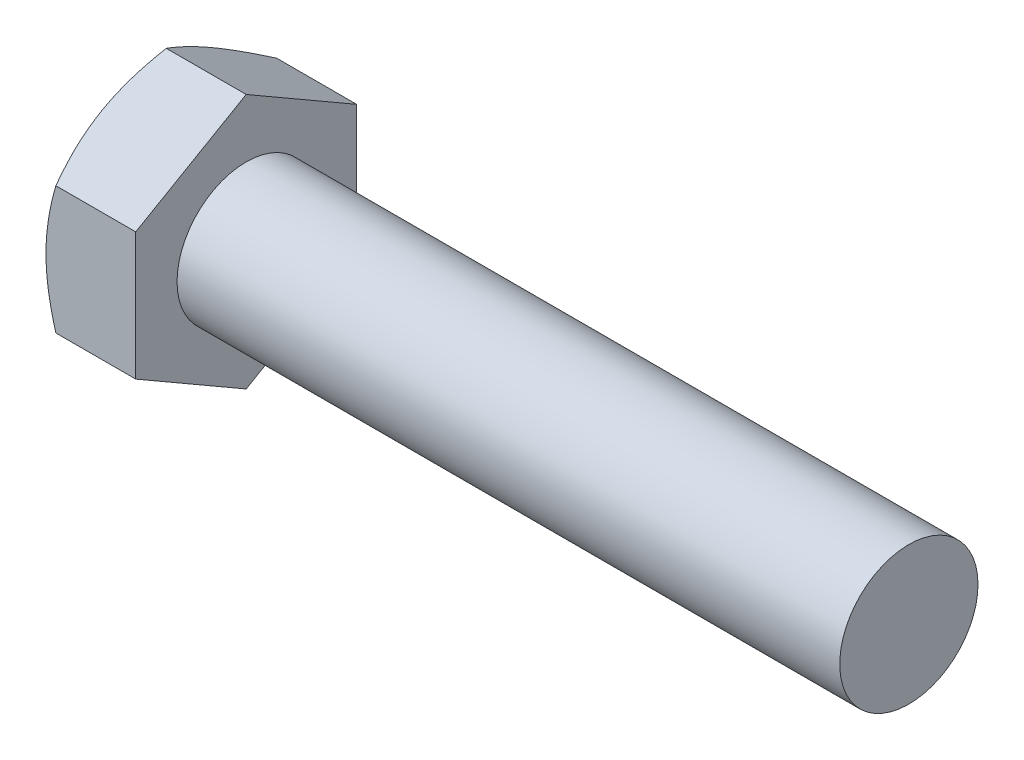
ISO-10303-21;
HEADER;
FILE_DESCRIPTION(('STEP AP214'),'2;1');
FILE_NAME('part.step','',(''),(''),'','','');
FILE_SCHEMA(('AUTOMOTIVE_DESIGN { 1 0 10303 214 1 1 1 1 }'));
ENDSEC;
DATA;
#1=APPLICATION_CONTEXT('core data for automotive mechanical design processes');
#2=APPLICATION_PROTOCOL_DEFINITION('international standard','automotive_design',2000,#1);
#3=PRODUCT_CONTEXT('',#1,'mechanical');
#4=PRODUCT('Part','Part','',(#3));
#5=PRODUCT_RELATED_PRODUCT_CATEGORY('part','',(#4));
#6=PRODUCT_DEFINITION_FORMATION('','',#4);
#7=PRODUCT_DEFINITION_CONTEXT('part definition',#1,'design');
#8=PRODUCT_DEFINITION('design','',#6,#7);
#9=PRODUCT_DEFINITION_SHAPE('','',#8);
#10=(LENGTH_UNIT() NAMED_UNIT(*) SI_UNIT(.MILLI.,.METRE.));
#11=(NAMED_UNIT(*) PLANE_ANGLE_UNIT() SI_UNIT($,.RADIAN.));
#12=(NAMED_UNIT(*) SI_UNIT($,.STERADIAN.) SOLID_ANGLE_UNIT());
#13=UNCERTAINTY_MEASURE_WITH_UNIT(LENGTH_MEASURE(1.E-05),#10,'distance_accuracy_value','');
#14=(GEOMETRIC_REPRESENTATION_CONTEXT(3) GLOBAL_UNCERTAINTY_ASSIGNED_CONTEXT((#13)) GLOBAL_UNIT_ASSIGNED_CONTEXT((#10,
#11,#12)) REPRESENTATION_CONTEXT('',''));
#15=CARTESIAN_POINT('',(0.,0.,0.));
#16=DIRECTION('',(0.,0.,1.));
#17=DIRECTION('',(1.,0.,0.));
#18=AXIS2_PLACEMENT_3D('',#15,#16,#17);
#19=CARTESIAN_POINT('',(-21.6296875,-3.66617420935412,6.35));
#20=DIRECTION('',(0.,0.,-1.));
#21=DIRECTION('',(0.,1.,0.));
#22=AXIS2_PLACEMENT_3D('',#19,#20,#21);
#23=PLANE('',#22);
#24=CARTESIAN_POINT('',(-18.4541834769885,-10.0051578251258,6.35));
#25=CARTESIAN_POINT('',(-18.5900222234139,-9.72641871453256,6.35));
#26=CARTESIAN_POINT('',(-18.7246031142947,-9.44705632305443,6.35));
#27=CARTESIAN_POINT('',(-18.9905446423704,-8.88675404130045,6.35));
#28=CARTESIAN_POINT('',(-19.1219048009689,-8.60581392410908,6.35));
#29=CARTESIAN_POINT('',(-19.3813277378285,-8.0406522250816,6.35));
#30=CARTESIAN_POINT('',(-19.5093699902051,-7.75642118995143,6.35));
#31=CARTESIAN_POINT('',(-19.7604196639286,-7.18575243067032,6.35));
#32=CARTESIAN_POINT('',(-19.8834273132207,-6.89931480712349,6.35));
#33=CARTESIAN_POINT('',(-20.1271475764687,-6.31401786014467,6.35));
#34=CARTESIAN_POINT('',(-20.2476408636132,-6.0150667257098,6.35));
#35=CARTESIAN_POINT('',(-20.47988315396,-5.41372540128068,6.35));
#36=CARTESIAN_POINT('',(-20.5916311984423,-5.11133483838043,6.35));
#37=CARTESIAN_POINT('',(-20.8035649270712,-4.50315126065895,6.35));
#38=CARTESIAN_POINT('',(-20.9037727029784,-4.19736601814086,6.35));
#39=CARTESIAN_POINT('',(-21.0895141243889,-3.58140865935075,6.35));
#40=CARTESIAN_POINT('',(-21.1750522271364,-3.27123790669066,6.35));
#41=CARTESIAN_POINT('',(-21.3270038522021,-2.64806579192565,6.35));
#42=CARTESIAN_POINT('',(-21.3935245757886,-2.33509098307937,6.35));
#43=CARTESIAN_POINT('',(-21.5037700576967,-1.70504553693546,6.35));
#44=CARTESIAN_POINT('',(-21.5474973030166,-1.38797535035514,6.35));
#45=CARTESIAN_POINT('',(-21.5930975842862,-0.912675962009664,6.35));
#46=CARTESIAN_POINT('',(-21.6049514186587,-0.7553670385577,6.35));
#47=CARTESIAN_POINT('',(-21.6219951344209,-0.440381615119712,6.35));
#48=CARTESIAN_POINT('',(-21.6271851309861,-0.282705121533834,6.35));
#49=CARTESIAN_POINT('',(-21.6307695942273,0.0327256239929831,6.35));
#50=CARTESIAN_POINT('',(-21.6291640243312,0.190479876347832,6.35));
#51=CARTESIAN_POINT('',(-21.6192001734955,0.505777218224735,6.35));
#52=CARTESIAN_POINT('',(-21.6108415849363,0.663320297799779,6.35));
#53=CARTESIAN_POINT('',(-21.5831706727625,1.03721532467461,6.35));
#54=CARTESIAN_POINT('',(-21.5609173960211,1.25335459941585,6.35));
#55=CARTESIAN_POINT('',(-21.5048783149472,1.68412111995772,6.35));
#56=CARTESIAN_POINT('',(-21.471091076449,1.89874817433563,6.35));
#57=CARTESIAN_POINT('',(-21.3542124834382,2.54005767892036,6.35));
#58=CARTESIAN_POINT('',(-21.2556219738062,2.96395796144147,6.35));
#59=CARTESIAN_POINT('',(-21.0834504797159,3.59815173246438,6.35));
#60=CARTESIAN_POINT('',(-21.021156614797,3.8116994086178,6.35));
#61=CARTESIAN_POINT('',(-20.8898005131534,4.23672342972449,6.35));
#62=CARTESIAN_POINT('',(-20.8207382240341,4.44819975862949,6.35));
#63=CARTESIAN_POINT('',(-20.6769779868225,4.86914435236875,6.35));
#64=CARTESIAN_POINT('',(-20.6022816144661,5.07861316032889,6.35));
#65=CARTESIAN_POINT('',(-20.4481618438055,5.49579319916624,6.35));
#66=CARTESIAN_POINT('',(-20.3687385552769,5.70350447073178,6.35));
#67=CARTESIAN_POINT('',(-20.1482070441155,6.26416646558949,6.35));
#68=CARTESIAN_POINT('',(-20.0033075203753,6.61562453038353,6.35));
#69=CARTESIAN_POINT('',(-19.7049487480407,7.31490207900984,6.35));
#70=CARTESIAN_POINT('',(-19.5514885353227,7.66272114775062,6.35));
#71=CARTESIAN_POINT('',(-19.238041423217,8.35555939048495,6.35));
#72=CARTESIAN_POINT('',(-19.078052001844,8.70057741965515,6.35));
#73=CARTESIAN_POINT('',(-18.7531138915422,9.38824468336702,6.35));
#74=CARTESIAN_POINT('',(-18.5881654080802,9.73089401532849,6.35));
#75=CARTESIAN_POINT('',(-18.2541212708977,10.4148507460789,6.35));
#76=CARTESIAN_POINT('',(-18.0850193149363,10.7561550603316,6.35));
#77=CARTESIAN_POINT('',(-17.7437334361715,11.4372202754995,6.35));
#78=CARTESIAN_POINT('',(-17.571549487255,11.7769811633068,6.35));
#79=CARTESIAN_POINT('',(-17.2247458031027,12.455159668309,6.35));
#80=CARTESIAN_POINT('',(-17.0501266240083,12.7935775702421,6.35));
#81=CARTESIAN_POINT('',(-16.6988714704939,13.4693656966434,6.35));
#82=CARTESIAN_POINT('',(-16.5222354879573,13.8067359168882,6.35));
#83=CARTESIAN_POINT('',(-16.0276174544001,14.7458348373303,6.35));
#84=CARTESIAN_POINT('',(-15.7078235005033,15.3466090084088,6.35));
#85=CARTESIAN_POINT('',(-15.0644003292289,16.5461439591149,6.35));
#86=CARTESIAN_POINT('',(-14.7407708724887,17.1449046100593,6.35));
#87=CARTESIAN_POINT('',(-14.0917638918913,18.3388504326276,6.35));
#88=CARTESIAN_POINT('',(-13.7663960008409,18.934040845617,6.35));
#89=CARTESIAN_POINT('',(-13.1134796602368,20.1231630021511,6.35));
#90=CARTESIAN_POINT('',(-12.7859313871246,20.7170948425355,6.35));
#91=CARTESIAN_POINT('',(-12.4575914110705,21.3105854625202,6.35));
#92=B_SPLINE_CURVE_WITH_KNOTS('',3,(#24,#25,#26,#27,#28,#29,#30,#31,#32,#33,#34,#35,#36,#37,#38,
#39,#40,#41,#42,#43,#44,#45,#46,#47,#48,#49,#50,#51,#52,#53,#54,#55,#56,#57,#58,#59,#60,#61,#62,
#63,#64,#65,#66,#67,#68,#69,#70,#71,#72,#73,#74,#75,#76,#77,#78,#79,#80,#81,#82,#83,#84,#85,#86,
#87,#88,#89,#90,#91),.UNSPECIFIED.,.F.,.F.,(4,2,2,2,2,2,2,2,2,2,2,2,2,2,2,2,2,2,2,2,2,2,2,2,2,2,
2,2,2,2,2,2,2,4),(0.,0.930241206579807,1.86061981807342,2.79580195408029,3.73094170211175,
4.69779706111132,5.66475826610128,6.62983649690372,7.59462097610561,8.55385459215178,
9.51298352422013,9.9861285847446,10.4592654674842,10.9324048965369,11.4055658796801,
12.057046804855,12.7086087665508,14.0123635805859,14.6796475701139,15.3469367255037,
16.0140399410946,16.681127670241,17.8214258704029,18.961852753759,20.1027243891645,
21.2435488202467,22.3862266665416,23.5289141991518,24.6713449123072,25.8137802248676,
27.8555177100868,29.8973832922459,31.9323333342056,33.9671206581205),.UNSPECIFIED.);
#93=CARTESIAN_POINT('',(-21.0625283760208,-3.66617420935412,6.35));
#94=VERTEX_POINT('',#93);
#95=CARTESIAN_POINT('',(-21.6296875,0.,6.35));
#96=VERTEX_POINT('',#95);
#97=EDGE_CURVE('E282',#94,#96,#92,.T.);
#98=ORIENTED_EDGE('',*,*,#97,.F.);
#99=DIRECTION('',(1.,0.,0.));
#100=VECTOR('',#99,1.);
#101=CARTESIAN_POINT('',(-21.6296875,-3.66617420935412,6.35));
#102=LINE('',#101,#100);
#103=CARTESIAN_POINT('',(-16.4703125,-3.66617420935412,6.35));
#104=VERTEX_POINT('',#103);
#105=EDGE_CURVE('E258',#94,#104,#102,.T.);
#106=ORIENTED_EDGE('',*,*,#105,.T.);
#107=DIRECTION('',(0.,1.,0.));
#108=VECTOR('',#107,1.);
#109=CARTESIAN_POINT('',(-16.4703125,-3.66617420935412,6.35));
#110=LINE('',#109,#108);
#111=CARTESIAN_POINT('',(-16.4703125,3.66617420935412,6.35));
#112=VERTEX_POINT('',#111);
#113=EDGE_CURVE('E279',#104,#112,#110,.T.);
#114=ORIENTED_EDGE('',*,*,#113,.T.);
#115=DIRECTION('',(1.,0.,0.));
#116=VECTOR('',#115,1.);
#117=CARTESIAN_POINT('',(-21.6296875,3.66617420935412,6.35));
#118=LINE('',#117,#116);
#119=CARTESIAN_POINT('',(-21.0625283760208,3.66617420935412,6.35));
#120=VERTEX_POINT('',#119);
#121=EDGE_CURVE('E242',#120,#112,#118,.T.);
#122=ORIENTED_EDGE('',*,*,#121,.F.);
#123=EDGE_CURVE('E123',#96,#120,#92,.T.);
#124=ORIENTED_EDGE('',*,*,#123,.F.);
#125=EDGE_LOOP('',(#98,#106,#114,#122,#124));
#126=FACE_BOUND('',#125,.T.);
#127=ADVANCED_FACE('F46',(#126),#23,.F.);
#128=CARTESIAN_POINT('',(-21.6296875,3.66617420935412,6.35));
#129=DIRECTION('',(0.,-0.866025403784439,-0.5));
#130=DIRECTION('',(0.,0.5,-0.866025403784439));
#131=AXIS2_PLACEMENT_3D('',#128,#129,#130);
#132=PLANE('',#131);
#133=CARTESIAN_POINT('',(-21.0624617077793,3.66605873930028,6.3502));
#134=CARTESIAN_POINT('',(-21.1089817041145,3.74664547796792,6.21061967421138));
#135=CARTESIAN_POINT('',(-21.1533904674141,3.82753268308249,6.07051892527071));
#136=CARTESIAN_POINT('',(-21.2374040495476,3.98996398524061,5.78917965719327));
#137=CARTESIAN_POINT('',(-21.2770067960239,4.07150834960367,5.64794067504554));
#138=CARTESIAN_POINT('',(-21.3878286761901,4.3174470761041,5.22196230519801));
#139=CARTESIAN_POINT('',(-21.4508630177976,4.48281224427705,4.93554143212029));
#140=CARTESIAN_POINT('',(-21.5247784283044,4.73027821122563,4.50691780422117));
#141=CARTESIAN_POINT('',(-21.5458348320668,4.81163960303488,4.36599573983305));
#142=CARTESIAN_POINT('',(-21.5811434553382,4.97473001999651,4.08351485142791));
#143=CARTESIAN_POINT('',(-21.5953962760328,5.05645901202216,3.94195608478808));
#144=CARTESIAN_POINT('',(-21.6167344957219,5.22005894556885,3.65859268777034));
#145=CARTESIAN_POINT('',(-21.6238280289767,5.30192961988371,3.51678852020707));
#146=CARTESIAN_POINT('',(-21.6307031791715,5.46574208117748,3.23305701433335));
#147=CARTESIAN_POINT('',(-21.6304850219891,5.54768386588139,3.0911296799633));
#148=CARTESIAN_POINT('',(-21.6198369234729,5.77217863345104,2.70229333649931));
#149=CARTESIAN_POINT('',(-21.6019608595915,5.9146581322581,2.45551160552853));
#150=CARTESIAN_POINT('',(-21.5452752941426,6.19867079116019,1.96358725031738));
#151=CARTESIAN_POINT('',(-21.5064464171341,6.34020295240188,1.71844635614174));
#152=CARTESIAN_POINT('',(-21.40938532975,6.6247872026121,1.22553197574375));
#153=CARTESIAN_POINT('',(-21.3507418750407,6.76780338177705,0.977820687125685));
#154=CARTESIAN_POINT('',(-21.2176448312893,7.05170294521182,0.486092219010033));
#155=CARTESIAN_POINT('',(-21.1432225068923,7.19258996539467,0.242068741926356));
#156=CARTESIAN_POINT('',(-21.0624617077793,7.33246388876209,-0.000200000000002482));
#157=B_SPLINE_CURVE_WITH_KNOTS('',3,(#133,#134,#135,#136,#137,#138,#139,#140,#141,#142,#143,
#144,#145,#146,#147,#148,#149,#150,#151,#152,#153,#154,#155,#156),.UNSPECIFIED.,.F.,.F.,(4,2,2,
2,2,2,2,2,2,2,2,4),(0.,0.503218195050232,1.00665261286994,2.01561339063536,2.50773694105499,
2.99981699787608,3.49133733019735,3.9828424781586,4.83850206575152,5.69495425638523,
6.57040160519864,7.44413026658513),.UNSPECIFIED.);
#158=CARTESIAN_POINT('',(-21.6296875,5.49926131403118,3.175));
#159=VERTEX_POINT('',#158);
#160=EDGE_CURVE('E119',#120,#159,#157,.T.);
#161=ORIENTED_EDGE('',*,*,#160,.F.);
#162=ORIENTED_EDGE('',*,*,#121,.T.);
#163=DIRECTION('',(0.,0.5,-0.866025403784439));
#164=VECTOR('',#163,1.);
#165=CARTESIAN_POINT('',(-16.4703125,3.66617420935412,6.35));
#166=LINE('',#165,#164);
#167=CARTESIAN_POINT('',(-16.4703125,7.33234841870825,0.));
#168=VERTEX_POINT('',#167);
#169=EDGE_CURVE('E277',#112,#168,#166,.T.);
#170=ORIENTED_EDGE('',*,*,#169,.T.);
#171=DIRECTION('',(1.,0.,0.));
#172=VECTOR('',#171,1.);
#173=CARTESIAN_POINT('',(-21.6296875,7.33234841870825,0.));
#174=LINE('',#173,#172);
#175=CARTESIAN_POINT('',(-21.0625283760208,7.33234841870825,0.));
#176=VERTEX_POINT('',#175);
#177=EDGE_CURVE('E144',#176,#168,#174,.T.);
#178=ORIENTED_EDGE('',*,*,#177,.F.);
#179=EDGE_CURVE('E128',#159,#176,#157,.T.);
#180=ORIENTED_EDGE('',*,*,#179,.F.);
#181=EDGE_LOOP('',(#161,#162,#170,#178,#180));
#182=FACE_BOUND('',#181,.T.);
#183=ADVANCED_FACE('F142',(#182),#132,.F.);
#184=CARTESIAN_POINT('',(-21.6296875,7.33234841870825,0.));
#185=DIRECTION('',(0.,-0.866025403784439,0.5));
#186=DIRECTION('',(0.,-0.5,-0.866025403784439));
#187=AXIS2_PLACEMENT_3D('',#184,#185,#186);
#188=PLANE('',#187);
#189=CARTESIAN_POINT('',(-21.0624617077793,7.33246388876209,0.000199999999997339));
#190=CARTESIAN_POINT('',(-21.1089817041145,7.25187715009445,-0.139380325788623));
#191=CARTESIAN_POINT('',(-21.1533904674141,7.17098994497988,-0.279481074729298));
#192=CARTESIAN_POINT('',(-21.2374040495476,7.00855864282176,-0.560820342806738));
#193=CARTESIAN_POINT('',(-21.2770067960239,6.9270142784587,-0.702059324954463));
#194=CARTESIAN_POINT('',(-21.3878286761901,6.68107555195827,-1.12803769480199));
#195=CARTESIAN_POINT('',(-21.4508630177976,6.51571038378532,-1.41445856787971));
#196=CARTESIAN_POINT('',(-21.5247784283044,6.26824441683674,-1.84308219577883));
#197=CARTESIAN_POINT('',(-21.5458348320668,6.18688302502749,-1.98400426016696));
#198=CARTESIAN_POINT('',(-21.5811434553382,6.02379260806586,-2.26648514857209));
#199=CARTESIAN_POINT('',(-21.5953962760328,5.94206361604021,-2.40804391521192));
#200=CARTESIAN_POINT('',(-21.6167344957219,5.77846368249352,-2.69140731222967));
#201=CARTESIAN_POINT('',(-21.6238280289767,5.69659300817866,-2.83321147979293));
#202=CARTESIAN_POINT('',(-21.6307031791715,5.53278054688489,-3.11694298566665));
#203=CARTESIAN_POINT('',(-21.6304850219891,5.45083876218098,-3.2588703200367));
#204=CARTESIAN_POINT('',(-21.6198369234729,5.22634399461133,-3.6477066635007));
#205=CARTESIAN_POINT('',(-21.6019608595915,5.08386449580427,-3.89448839447147));
#206=CARTESIAN_POINT('',(-21.5452752941426,4.79985183690218,-4.38641274968263));
#207=CARTESIAN_POINT('',(-21.5064464171341,4.65831967566049,-4.63155364385827));
#208=CARTESIAN_POINT('',(-21.40938532975,4.37373542545027,-5.12446802425625));
#209=CARTESIAN_POINT('',(-21.3507418750407,4.23071924628532,-5.37217931287431));
#210=CARTESIAN_POINT('',(-21.2176448312893,3.94681968285055,-5.86390778098997));
#211=CARTESIAN_POINT('',(-21.1432225068923,3.8059326626677,-6.10793125807364));
#212=CARTESIAN_POINT('',(-21.0624617077793,3.66605873930029,-6.3502));
#213=B_SPLINE_CURVE_WITH_KNOTS('',3,(#189,#190,#191,#192,#193,#194,#195,#196,#197,#198,#199,
#200,#201,#202,#203,#204,#205,#206,#207,#208,#209,#210,#211,#212),.UNSPECIFIED.,.F.,.F.,(4,2,2,
2,2,2,2,2,2,2,2,4),(0.,0.503218195050232,1.00665261286994,2.01561339063536,2.50773694105499,
2.99981699787608,3.49133733019735,3.9828424781586,4.83850206575152,5.69495425638522,
6.57040160519864,7.44413026658512),.UNSPECIFIED.);
#214=CARTESIAN_POINT('',(-21.6296875,5.49926131403118,-3.175));
#215=VERTEX_POINT('',#214);
#216=EDGE_CURVE('E133',#176,#215,#213,.T.);
#217=ORIENTED_EDGE('',*,*,#216,.F.);
#218=ORIENTED_EDGE('',*,*,#177,.T.);
#219=DIRECTION('',(0.,-0.5,-0.866025403784439));
#220=VECTOR('',#219,1.);
#221=CARTESIAN_POINT('',(-16.4703125,7.33234841870825,0.));
#222=LINE('',#221,#220);
#223=CARTESIAN_POINT('',(-16.4703125,3.66617420935413,-6.35));
#224=VERTEX_POINT('',#223);
#225=EDGE_CURVE('E273',#168,#224,#222,.T.);
#226=ORIENTED_EDGE('',*,*,#225,.T.);
#227=DIRECTION('',(1.,0.,0.));
#228=VECTOR('',#227,1.);
#229=CARTESIAN_POINT('',(-21.6296875,3.66617420935413,-6.35));
#230=LINE('',#229,#228);
#231=CARTESIAN_POINT('',(-21.0625283760208,3.66617420935412,-6.35));
#232=VERTEX_POINT('',#231);
#233=EDGE_CURVE('E249',#232,#224,#230,.T.);
#234=ORIENTED_EDGE('',*,*,#233,.F.);
#235=EDGE_CURVE('E147',#215,#232,#213,.T.);
#236=ORIENTED_EDGE('',*,*,#235,.F.);
#237=EDGE_LOOP('',(#217,#218,#226,#234,#236));
#238=FACE_BOUND('',#237,.T.);
#239=ADVANCED_FACE('F208',(#238),#188,.F.);
#240=CARTESIAN_POINT('',(-21.6296875,3.66617420935413,-6.35));
#241=DIRECTION('',(0.,0.,1.));
#242=DIRECTION('',(1.,0.,0.));
#243=AXIS2_PLACEMENT_3D('',#240,#241,#242);
#244=PLANE('',#243);
#245=CARTESIAN_POINT('',(-18.4541834802712,-10.0051578183916,-6.35));
#246=CARTESIAN_POINT('',(-18.5900222265598,-9.72641870802509,-6.35));
#247=CARTESIAN_POINT('',(-18.7246031173039,-9.44705631677388,-6.35));
#248=CARTESIAN_POINT('',(-18.990544645107,-8.88675403547443,-6.35));
#249=CARTESIAN_POINT('',(-19.1219048035695,-8.60581391851068,-6.35));
#250=CARTESIAN_POINT('',(-19.381327740157,-8.04065221994183,-6.35));
#251=CARTESIAN_POINT('',(-19.5093699923975,-7.7564211850427,-6.35));
#252=CARTESIAN_POINT('',(-19.7604196658511,-7.1857524262252,-6.35));
#253=CARTESIAN_POINT('',(-19.8834273150094,-6.89931480291096,-6.35));
#254=CARTESIAN_POINT('',(-20.1271475779857,-6.31401785641581,-6.35));
#255=CARTESIAN_POINT('',(-20.2476408649925,-6.01506672223218,-6.35));
#256=CARTESIAN_POINT('',(-20.4798831550713,-5.41372539830955,-6.35));
#257=CARTESIAN_POINT('',(-20.5916311994232,-5.11133483566456,-6.35));
#258=CARTESIAN_POINT('',(-20.8035649278037,-4.50315125845829,-6.35));
#259=CARTESIAN_POINT('',(-20.9037727035928,-4.19736601620014,-6.35));
#260=CARTESIAN_POINT('',(-21.0895141247861,-3.58140865793696,-6.35));
#261=CARTESIAN_POINT('',(-21.1750522274346,-3.27123790554385,-6.35));
#262=CARTESIAN_POINT('',(-21.3270038523001,-2.64806579144828,-6.35));
#263=CARTESIAN_POINT('',(-21.3935245757929,-2.3350909830063,-6.35));
#264=CARTESIAN_POINT('',(-21.5037700575746,-1.70504553768109,-6.35));
#265=CARTESIAN_POINT('',(-21.5474973028617,-1.38797535151515,-6.35));
#266=CARTESIAN_POINT('',(-21.5930975841372,-0.91267596378846,-6.35));
#267=CARTESIAN_POINT('',(-21.6049514185206,-0.75536704053973,-6.35));
#268=CARTESIAN_POINT('',(-21.6219951343226,-0.440381617507909,-6.35));
#269=CARTESIAN_POINT('',(-21.6271851309166,-0.282705124124961,-6.35));
#270=CARTESIAN_POINT('',(-21.6307695942333,0.0327256209974689,-6.35));
#271=CARTESIAN_POINT('',(-21.6291640243838,0.190479873150862,-6.35));
#272=CARTESIAN_POINT('',(-21.6192001736577,0.505777214627439,-6.35));
#273=CARTESIAN_POINT('',(-21.6108415851615,0.663320294003614,-6.35));
#274=CARTESIAN_POINT('',(-21.5831706731426,1.03721532057395,-6.35));
#275=CARTESIAN_POINT('',(-21.5609173964902,1.25335459521043,-6.35));
#276=CARTESIAN_POINT('',(-21.504878315599,1.68412111554759,-6.35));
#277=CARTESIAN_POINT('',(-21.4710910771945,1.89874816982555,-6.35));
#278=CARTESIAN_POINT('',(-21.3542124844667,2.54005767411599,-6.35));
#279=CARTESIAN_POINT('',(-21.2556219750258,2.96395795644879,-6.35));
#280=CARTESIAN_POINT('',(-21.0834504812174,3.59815172719005,-6.35));
#281=CARTESIAN_POINT('',(-21.0211566163931,3.81169940324754,-6.35));
#282=CARTESIAN_POINT('',(-20.8898005149357,4.23672342416345,-6.35));
#283=CARTESIAN_POINT('',(-20.820738225908,4.44819975297362,-6.35));
#284=CARTESIAN_POINT('',(-20.6769779888763,4.86914434652396,-6.35));
#285=CARTESIAN_POINT('',(-20.6022816166081,5.07861315439,-6.35));
#286=CARTESIAN_POINT('',(-20.4481618461209,5.49579319303915,-6.35));
#287=CARTESIAN_POINT('',(-20.3687385576775,5.70350446451057,-6.35));
#288=CARTESIAN_POINT('',(-20.1482070466631,6.26416645931567,-6.35));
#289=CARTESIAN_POINT('',(-20.0033075229753,6.61562452414837,-6.35));
#290=CARTESIAN_POINT('',(-19.7049487507304,7.31490207284698,-6.35));
#291=CARTESIAN_POINT('',(-19.5514885380495,7.66272114162141,-6.35));
#292=CARTESIAN_POINT('',(-19.2380414260072,8.35555938441946,-6.35));
#293=CARTESIAN_POINT('',(-19.0780520046602,8.70057741361972,-6.35));
#294=CARTESIAN_POINT('',(-18.7531138944028,9.38824467738844,-6.35));
#295=CARTESIAN_POINT('',(-18.5881654109591,9.7308940093767,-6.35));
#296=CARTESIAN_POINT('',(-18.2541212738067,10.4148507401799,-6.35));
#297=CARTESIAN_POINT('',(-18.085019317857,10.7561550544587,-6.35));
#298=CARTESIAN_POINT('',(-17.7437334391116,11.4372202696767,-6.35));
#299=CARTESIAN_POINT('',(-17.5715494902026,11.7769811575081,-6.35));
#300=CARTESIAN_POINT('',(-17.2247458060622,12.4551596625566,-6.35));
#301=CARTESIAN_POINT('',(-17.0501266269722,12.793577564512,-6.35));
#302=CARTESIAN_POINT('',(-16.6988714734642,13.4693656909567,-6.35));
#303=CARTESIAN_POINT('',(-16.5222354909295,13.8067359112226,-6.35));
#304=CARTESIAN_POINT('',(-16.0276174573938,14.7458348316867,-6.35));
#305=CARTESIAN_POINT('',(-15.7078235035149,15.3466090027653,-6.35));
#306=CARTESIAN_POINT('',(-15.0644003322724,16.5461439534699,-6.35));
#307=CARTESIAN_POINT('',(-14.7407708755463,17.1449046044126,-6.35));
#308=CARTESIAN_POINT('',(-14.0917638949782,18.3388504269704,-6.35));
#309=CARTESIAN_POINT('',(-13.7663960039428,18.9340408399509,-6.35));
#310=CARTESIAN_POINT('',(-13.1134796633672,20.123162996466,-6.35));
#311=CARTESIAN_POINT('',(-12.7859313902684,20.7170948368405,-6.35));
#312=CARTESIAN_POINT('',(-12.4575914142273,21.3105854568149,-6.35));
#313=B_SPLINE_CURVE_WITH_KNOTS('',3,(#245,#246,#247,#248,#249,#250,#251,#252,#253,#254,#255,
#256,#257,#258,#259,#260,#261,#262,#263,#264,#265,#266,#267,#268,#269,#270,#271,#272,#273,#274,
#275,#276,#277,#278,#279,#280,#281,#282,#283,#284,#285,#286,#287,#288,#289,#290,#291,#292,#293,
#294,#295,#296,#297,#298,#299,#300,#301,#302,#303,#304,#305,#306,#307,#308,#309,#310,#311,#312),
.UNSPECIFIED.,.F.,.F.,(4,2,2,2,2,2,2,2,2,2,2,2,2,2,2,2,2,2,2,2,2,2,2,2,2,2,2,2,2,2,2,2,2,4),(0.,
0.93024120578853,1.86061981649075,2.79580195169803,3.73094169892996,4.69779705707614,
5.66475826121242,6.62983649116392,7.59462096951554,8.55385458431944,9.51298351514732,
9.98612857506677,10.4592654572013,10.9324048856488,11.4055658681868,12.0570467930218,
12.7086087543779,14.0123635677318,14.6796475569039,15.3469367119378,16.0140399271738,
16.6811276559652,17.8214258561736,18.9618527395769,20.1027243750311,21.2435488061617,
22.3862266525109,23.5289141851753,24.6713448983841,25.8137802109978,27.855517696192,
29.8973832783267,31.9323333202412,33.9671206441104),.UNSPECIFIED.);
#314=CARTESIAN_POINT('',(-21.6296875,0.,-6.35));
#315=VERTEX_POINT('',#314);
#316=EDGE_CURVE('E202',#232,#315,#313,.F.);
#317=ORIENTED_EDGE('',*,*,#316,.F.);
#318=ORIENTED_EDGE('',*,*,#233,.T.);
#319=DIRECTION('',(0.,-1.,0.));
#320=VECTOR('',#319,1.);
#321=CARTESIAN_POINT('',(-16.4703125,3.66617420935413,-6.35));
#322=LINE('',#321,#320);
#323=CARTESIAN_POINT('',(-16.4703125,-3.66617420935413,-6.35));
#324=VERTEX_POINT('',#323);
#325=EDGE_CURVE('E269',#224,#324,#322,.T.);
#326=ORIENTED_EDGE('',*,*,#325,.T.);
#327=DIRECTION('',(1.,0.,0.));
#328=VECTOR('',#327,1.);
#329=CARTESIAN_POINT('',(-21.6296875,-3.66617420935413,-6.35));
#330=LINE('',#329,#328);
#331=CARTESIAN_POINT('',(-21.0625283760208,-3.66617420935413,-6.35));
#332=VERTEX_POINT('',#331);
#333=EDGE_CURVE('E252',#332,#324,#330,.T.);
#334=ORIENTED_EDGE('',*,*,#333,.F.);
#335=EDGE_CURVE('E195',#315,#332,#313,.F.);
#336=ORIENTED_EDGE('',*,*,#335,.F.);
#337=EDGE_LOOP('',(#317,#318,#326,#334,#336));
#338=FACE_BOUND('',#337,.T.);
#339=ADVANCED_FACE('F204',(#338),#244,.F.);
#340=CARTESIAN_POINT('',(-21.6296875,-3.66617420935413,-6.35));
#341=DIRECTION('',(0.,0.866025403784439,0.5));
#342=DIRECTION('',(0.,-0.5,0.866025403784439));
#343=AXIS2_PLACEMENT_3D('',#340,#341,#342);
#344=PLANE('',#343);
#345=CARTESIAN_POINT('',(-21.0624617077793,-3.66605873930029,-6.3502));
#346=CARTESIAN_POINT('',(-21.1089817041145,-3.74664547796792,-6.21061967421138));
#347=CARTESIAN_POINT('',(-21.1533904674141,-3.82753268308249,-6.0705189252707));
#348=CARTESIAN_POINT('',(-21.2374040495476,-3.98996398524061,-5.78917965719326));
#349=CARTESIAN_POINT('',(-21.2770067960239,-4.07150834960367,-5.64794067504554));
#350=CARTESIAN_POINT('',(-21.3878286761901,-4.3174470761041,-5.22196230519801));
#351=CARTESIAN_POINT('',(-21.4508630177976,-4.48281224427705,-4.93554143212029));
#352=CARTESIAN_POINT('',(-21.5247784283044,-4.73027821122564,-4.50691780422117));
#353=CARTESIAN_POINT('',(-21.5458348320668,-4.81163960303488,-4.36599573983305));
#354=CARTESIAN_POINT('',(-21.5811434553382,-4.97473001999651,-4.08351485142791));
#355=CARTESIAN_POINT('',(-21.5953962760328,-5.05645901202217,-3.94195608478808));
#356=CARTESIAN_POINT('',(-21.6167344957219,-5.22005894556885,-3.65859268777033));
#357=CARTESIAN_POINT('',(-21.6238280289767,-5.30192961988371,-3.51678852020707));
#358=CARTESIAN_POINT('',(-21.6307031791715,-5.46574208117748,-3.23305701433335));
#359=CARTESIAN_POINT('',(-21.6304850219891,-5.5476838658814,-3.0911296799633));
#360=CARTESIAN_POINT('',(-21.6198369234729,-5.77217863345104,-2.70229333649931));
#361=CARTESIAN_POINT('',(-21.6019608595915,-5.9146581322581,-2.45551160552853));
#362=CARTESIAN_POINT('',(-21.5452752941426,-6.1986707911602,-1.96358725031738));
#363=CARTESIAN_POINT('',(-21.5064464171341,-6.34020295240189,-1.71844635614174));
#364=CARTESIAN_POINT('',(-21.40938532975,-6.6247872026121,-1.22553197574375));
#365=CARTESIAN_POINT('',(-21.3507418750407,-6.76780338177705,-0.977820687125687));
#366=CARTESIAN_POINT('',(-21.2176448312893,-7.05170294521182,-0.486092219010036));
#367=CARTESIAN_POINT('',(-21.1432225068923,-7.19258996539467,-0.242068741926359));
#368=CARTESIAN_POINT('',(-21.0624617077793,-7.33246388876209,0.000199999999999449));
#369=B_SPLINE_CURVE_WITH_KNOTS('',3,(#345,#346,#347,#348,#349,#350,#351,#352,#353,#354,#355,
#356,#357,#358,#359,#360,#361,#362,#363,#364,#365,#366,#367,#368),.UNSPECIFIED.,.F.,.F.,(4,2,2,
2,2,2,2,2,2,2,2,4),(0.,0.503218195050233,1.00665261286994,2.01561339063536,2.50773694105499,
2.99981699787608,3.49133733019735,3.9828424781586,4.83850206575152,5.69495425638522,
6.57040160519864,7.44413026658512),.UNSPECIFIED.);
#370=CARTESIAN_POINT('',(-21.6296875,-5.49926131403118,-3.175));
#371=VERTEX_POINT('',#370);
#372=EDGE_CURVE('E203',#332,#371,#369,.T.);
#373=ORIENTED_EDGE('',*,*,#372,.F.);
#374=ORIENTED_EDGE('',*,*,#333,.T.);
#375=DIRECTION('',(0.,-0.5,0.866025403784439));
#376=VECTOR('',#375,1.);
#377=CARTESIAN_POINT('',(-16.4703125,-3.66617420935413,-6.35));
#378=LINE('',#377,#376);
#379=CARTESIAN_POINT('',(-16.4703125,-7.33234841870825,0.));
#380=VERTEX_POINT('',#379);
#381=EDGE_CURVE('E265',#324,#380,#378,.T.);
#382=ORIENTED_EDGE('',*,*,#381,.T.);
#383=DIRECTION('',(1.,0.,0.));
#384=VECTOR('',#383,1.);
#385=CARTESIAN_POINT('',(-21.6296875,-7.33234841870825,0.));
#386=LINE('',#385,#384);
#387=CARTESIAN_POINT('',(-21.0625283760208,-7.33234841870825,0.));
#388=VERTEX_POINT('',#387);
#389=EDGE_CURVE('E255',#388,#380,#386,.T.);
#390=ORIENTED_EDGE('',*,*,#389,.F.);
#391=EDGE_CURVE('E189',#371,#388,#369,.T.);
#392=ORIENTED_EDGE('',*,*,#391,.F.);
#393=EDGE_LOOP('',(#373,#374,#382,#390,#392));
#394=FACE_BOUND('',#393,.T.);
#395=ADVANCED_FACE('F207',(#394),#344,.F.);
#396=CARTESIAN_POINT('',(-21.6296875,-7.33234841870825,0.));
#397=DIRECTION('',(0.,0.866025403784439,-0.5));
#398=DIRECTION('',(0.,0.5,0.866025403784439));
#399=AXIS2_PLACEMENT_3D('',#396,#397,#398);
#400=PLANE('',#399);
#401=CARTESIAN_POINT('',(-21.0624617077793,-7.33246388876209,-0.000199999999999927));
#402=CARTESIAN_POINT('',(-21.1089817041145,-7.25187715009445,0.13938032578862));
#403=CARTESIAN_POINT('',(-21.1533904674141,-7.17098994497988,0.279481074729296));
#404=CARTESIAN_POINT('',(-21.2374040495476,-7.00855864282176,0.560820342806735));
#405=CARTESIAN_POINT('',(-21.2770067960239,-6.9270142784587,0.70205932495446));
#406=CARTESIAN_POINT('',(-21.3878286761901,-6.68107555195827,1.12803769480199));
#407=CARTESIAN_POINT('',(-21.4508630177976,-6.51571038378533,1.41445856787971));
#408=CARTESIAN_POINT('',(-21.5247784283044,-6.26824441683674,1.84308219577883));
#409=CARTESIAN_POINT('',(-21.5458348320668,-6.18688302502749,1.98400426016695));
#410=CARTESIAN_POINT('',(-21.5811434553382,-6.02379260806586,2.26648514857209));
#411=CARTESIAN_POINT('',(-21.5953962760328,-5.94206361604021,2.40804391521192));
#412=CARTESIAN_POINT('',(-21.6167344957219,-5.77846368249353,2.69140731222967));
#413=CARTESIAN_POINT('',(-21.6238280289767,-5.69659300817866,2.83321147979293));
#414=CARTESIAN_POINT('',(-21.6307031791715,-5.53278054688489,3.11694298566665));
#415=CARTESIAN_POINT('',(-21.6304850219891,-5.45083876218098,3.2588703200367));
#416=CARTESIAN_POINT('',(-21.6198369234729,-5.22634399461133,3.6477066635007));
#417=CARTESIAN_POINT('',(-21.6019608595915,-5.08386449580427,3.89448839447147));
#418=CARTESIAN_POINT('',(-21.5452752941426,-4.79985183690218,4.38641274968263));
#419=CARTESIAN_POINT('',(-21.5064464171341,-4.65831967566049,4.63155364385827));
#420=CARTESIAN_POINT('',(-21.40938532975,-4.37373542545027,5.12446802425626));
#421=CARTESIAN_POINT('',(-21.3507418750407,-4.23071924628532,5.37217931287432));
#422=CARTESIAN_POINT('',(-21.2176448312893,-3.94681968285055,5.86390778098997));
#423=CARTESIAN_POINT('',(-21.1432225068923,-3.8059326626677,6.10793125807365));
#424=CARTESIAN_POINT('',(-21.0624617077793,-3.66605873930029,6.3502));
#425=B_SPLINE_CURVE_WITH_KNOTS('',3,(#401,#402,#403,#404,#405,#406,#407,#408,#409,#410,#411,
#412,#413,#414,#415,#416,#417,#418,#419,#420,#421,#422,#423,#424),.UNSPECIFIED.,.F.,.F.,(4,2,2,
2,2,2,2,2,2,2,2,4),(0.,0.503218195050233,1.00665261286994,2.01561339063536,2.50773694105499,
2.99981699787608,3.49133733019735,3.9828424781586,4.83850206575152,5.69495425638523,
6.57040160519865,7.44413026658513),.UNSPECIFIED.);
#426=CARTESIAN_POINT('',(-21.6296875,-5.49926131403119,3.175));
#427=VERTEX_POINT('',#426);
#428=EDGE_CURVE('E317',#388,#427,#425,.T.);
#429=ORIENTED_EDGE('',*,*,#428,.F.);
#430=ORIENTED_EDGE('',*,*,#389,.T.);
#431=DIRECTION('',(0.,0.5,0.866025403784439));
#432=VECTOR('',#431,1.);
#433=CARTESIAN_POINT('',(-16.4703125,-7.33234841870825,0.));
#434=LINE('',#433,#432);
#435=EDGE_CURVE('E261',#380,#104,#434,.T.);
#436=ORIENTED_EDGE('',*,*,#435,.T.);
#437=ORIENTED_EDGE('',*,*,#105,.F.);
#438=EDGE_CURVE('E139',#427,#94,#425,.T.);
#439=ORIENTED_EDGE('',*,*,#438,.F.);
#440=EDGE_LOOP('',(#429,#430,#436,#437,#439));
#441=FACE_BOUND('',#440,.T.);
#442=ADVANCED_FACE('F231',(#441),#400,.F.);
#443=CARTESIAN_POINT('',(-16.4703125,0.,0.));
#444=DIRECTION('',(1.,0.,0.));
#445=DIRECTION('',(0.,0.,-1.));
#446=AXIS2_PLACEMENT_3D('',#443,#444,#445);
#447=CYLINDRICAL_SURFACE('',#446,3.9751);
#448=CARTESIAN_POINT('',(-16.4703125,0.,0.));
#449=DIRECTION('',(-1.,0.,0.));
#450=DIRECTION('',(0.,0.,1.));
#451=AXIS2_PLACEMENT_3D('',#448,#449,#450);
#452=CIRCLE('',#451,3.9751);
#453=CARTESIAN_POINT('',(-16.4703125,0.,3.9751));
#454=VERTEX_POINT('',#453);
#455=EDGE_CURVE('E238',#454,#454,#452,.F.);
#456=ORIENTED_EDGE('',*,*,#455,.T.);
#457=EDGE_LOOP('',(#456));
#458=FACE_BOUND('',#457,.T.);
#459=CARTESIAN_POINT('',(21.6296875,0.,0.));
#460=DIRECTION('',(1.,0.,0.));
#461=DIRECTION('',(0.,0.,-1.));
#462=AXIS2_PLACEMENT_3D('',#459,#460,#461);
#463=CIRCLE('',#462,3.9751);
#464=CARTESIAN_POINT('',(21.6296875,0.,-3.9751));
#465=VERTEX_POINT('',#464);
#466=EDGE_CURVE('E235',#465,#465,#463,.T.);
#467=ORIENTED_EDGE('',*,*,#466,.F.);
#468=EDGE_LOOP('',(#467));
#469=FACE_BOUND('',#468,.T.);
#470=ADVANCED_FACE('F48',(#458,#469),#447,.T.);
#471=CARTESIAN_POINT('',(21.6296875,0.,0.));
#472=DIRECTION('',(1.,0.,0.));
#473=DIRECTION('',(0.,0.,-1.));
#474=AXIS2_PLACEMENT_3D('',#471,#472,#473);
#475=PLANE('',#474);
#476=ORIENTED_EDGE('',*,*,#466,.T.);
#477=EDGE_LOOP('',(#476));
#478=FACE_BOUND('',#477,.T.);
#479=ADVANCED_FACE('F224',(#478),#475,.T.);
#480=CARTESIAN_POINT('',(-16.4703125,3.66617420935412,6.35));
#481=DIRECTION('',(-1.,0.,0.));
#482=DIRECTION('',(0.,0.,1.));
#483=AXIS2_PLACEMENT_3D('',#480,#481,#482);
#484=PLANE('',#483);
#485=ORIENTED_EDGE('',*,*,#455,.F.);
#486=EDGE_LOOP('',(#485));
#487=FACE_BOUND('',#486,.T.);
#488=ORIENTED_EDGE('',*,*,#113,.F.);
#489=ORIENTED_EDGE('',*,*,#435,.F.);
#490=ORIENTED_EDGE('',*,*,#381,.F.);
#491=ORIENTED_EDGE('',*,*,#325,.F.);
#492=ORIENTED_EDGE('',*,*,#225,.F.);
#493=ORIENTED_EDGE('',*,*,#169,.F.);
#494=EDGE_LOOP('',(#488,#489,#490,#491,#492,#493));
#495=FACE_BOUND('',#494,.T.);
#496=ADVANCED_FACE('F174',(#487,#495),#484,.F.);
#497=CARTESIAN_POINT('',(-21.6296875,0.,0.));
#498=DIRECTION('',(1.,0.,0.));
#499=DIRECTION('',(0.,0.,1.));
#500=AXIS2_PLACEMENT_3D('',#497,#498,#499);
#501=CONICAL_SURFACE('',#500,6.35,1.0471975511966);
#502=ORIENTED_EDGE('',*,*,#97,.T.);
#503=CARTESIAN_POINT('',(-21.6296875,0.,0.));
#504=DIRECTION('',(-1.,0.,0.));
#505=DIRECTION('',(0.,0.,1.));
#506=AXIS2_PLACEMENT_3D('',#503,#504,#505);
#507=CIRCLE('',#506,6.35);
#508=EDGE_CURVE('E50',#427,#96,#507,.T.);
#509=ORIENTED_EDGE('',*,*,#508,.F.);
#510=ORIENTED_EDGE('',*,*,#438,.T.);
#511=EDGE_LOOP('',(#502,#509,#510));
#512=FACE_BOUND('',#511,.T.);
#513=ADVANCED_FACE('F169',(#512),#501,.T.);
#514=ORIENTED_EDGE('',*,*,#391,.T.);
#515=ORIENTED_EDGE('',*,*,#428,.T.);
#516=EDGE_CURVE('E71',#371,#427,#507,.T.);
#517=ORIENTED_EDGE('',*,*,#516,.F.);
#518=EDGE_LOOP('',(#514,#515,#517));
#519=FACE_BOUND('',#518,.T.);
#520=ADVANCED_FACE('F173',(#519),#501,.T.);
#521=ORIENTED_EDGE('',*,*,#335,.T.);
#522=ORIENTED_EDGE('',*,*,#372,.T.);
#523=EDGE_CURVE('E307',#315,#371,#507,.T.);
#524=ORIENTED_EDGE('',*,*,#523,.F.);
#525=EDGE_LOOP('',(#521,#522,#524));
#526=FACE_BOUND('',#525,.T.);
#527=ADVANCED_FACE('F308',(#526),#501,.T.);
#528=ORIENTED_EDGE('',*,*,#235,.T.);
#529=ORIENTED_EDGE('',*,*,#316,.T.);
#530=EDGE_CURVE('E56',#215,#315,#507,.T.);
#531=ORIENTED_EDGE('',*,*,#530,.F.);
#532=EDGE_LOOP('',(#528,#529,#531));
#533=FACE_BOUND('',#532,.T.);
#534=ADVANCED_FACE('F304',(#533),#501,.T.);
#535=ORIENTED_EDGE('',*,*,#179,.T.);
#536=ORIENTED_EDGE('',*,*,#216,.T.);
#537=EDGE_CURVE('E12',#159,#215,#507,.T.);
#538=ORIENTED_EDGE('',*,*,#537,.F.);
#539=EDGE_LOOP('',(#535,#536,#538));
#540=FACE_BOUND('',#539,.T.);
#541=ADVANCED_FACE('F131',(#540),#501,.T.);
#542=ORIENTED_EDGE('',*,*,#123,.T.);
#543=ORIENTED_EDGE('',*,*,#160,.T.);
#544=CARTESIAN_POINT('',(-21.6296875,0.,0.));
#545=DIRECTION('',(-1.,0.,0.));
#546=DIRECTION('',(0.,0.,1.));
#547=AXIS2_PLACEMENT_3D('',#544,#545,#546);
#548=CIRCLE('',#547,6.35);
#549=EDGE_CURVE('E63',#96,#159,#548,.T.);
#550=ORIENTED_EDGE('',*,*,#549,.F.);
#551=EDGE_LOOP('',(#542,#543,#550));
#552=FACE_BOUND('',#551,.T.);
#553=ADVANCED_FACE('F121',(#552),#501,.T.);
#554=CARTESIAN_POINT('',(-21.6296875,3.66617420935412,6.35));
#555=DIRECTION('',(-1.,0.,0.));
#556=DIRECTION('',(0.,0.,1.));
#557=AXIS2_PLACEMENT_3D('',#554,#555,#556);
#558=PLANE('',#557);
#559=ORIENTED_EDGE('',*,*,#508,.T.);
#560=ORIENTED_EDGE('',*,*,#549,.T.);
#561=ORIENTED_EDGE('',*,*,#537,.T.);
#562=ORIENTED_EDGE('',*,*,#530,.T.);
#563=ORIENTED_EDGE('',*,*,#523,.T.);
#564=ORIENTED_EDGE('',*,*,#516,.T.);
#565=EDGE_LOOP('',(#559,#560,#561,#562,#563,#564));
#566=FACE_BOUND('',#565,.T.);
#567=ADVANCED_FACE('F137',(#566),#558,.T.);
#568=CLOSED_SHELL('',(#127,#183,#239,#339,#395,#442,#470,#479,#496,#513,#520,#527,#534,#541,
#553,#567));
#569=MANIFOLD_SOLID_BREP('B2',#568);
#570=ADVANCED_BREP_SHAPE_REPRESENTATION('',(#18,#569),#14);
#571=SHAPE_DEFINITION_REPRESENTATION(#9,#570);
ENDSEC;
END-ISO-10303-21;
